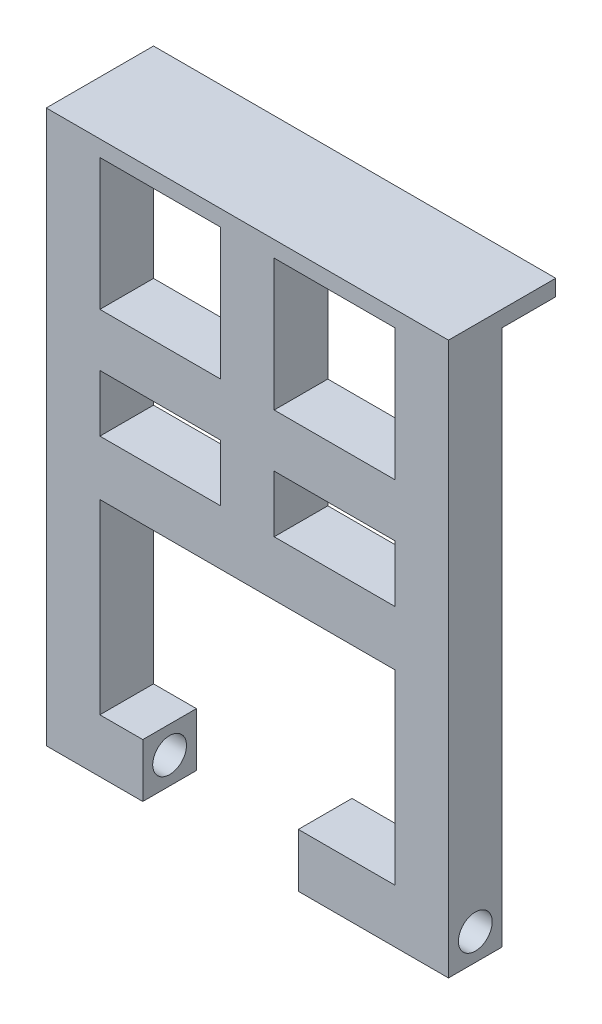
ISO-10303-21;
HEADER;
FILE_DESCRIPTION(('STEP AP214'),'2;1');
FILE_NAME('part.step','',(''),(''),'','','');
FILE_SCHEMA(('AUTOMOTIVE_DESIGN { 1 0 10303 214 1 1 1 1 }'));
ENDSEC;
DATA;
#1=APPLICATION_CONTEXT('core data for automotive mechanical design processes');
#2=APPLICATION_PROTOCOL_DEFINITION('international standard','automotive_design',2000,#1);
#3=PRODUCT_CONTEXT('',#1,'mechanical');
#4=PRODUCT('Part','Part','',(#3));
#5=PRODUCT_RELATED_PRODUCT_CATEGORY('part','',(#4));
#6=PRODUCT_DEFINITION_FORMATION('','',#4);
#7=PRODUCT_DEFINITION_CONTEXT('part definition',#1,'design');
#8=PRODUCT_DEFINITION('design','',#6,#7);
#9=PRODUCT_DEFINITION_SHAPE('','',#8);
#10=(LENGTH_UNIT() NAMED_UNIT(*) SI_UNIT(.MILLI.,.METRE.));
#11=(NAMED_UNIT(*) PLANE_ANGLE_UNIT() SI_UNIT($,.RADIAN.));
#12=(NAMED_UNIT(*) SI_UNIT($,.STERADIAN.) SOLID_ANGLE_UNIT());
#13=UNCERTAINTY_MEASURE_WITH_UNIT(LENGTH_MEASURE(1.E-05),#10,'distance_accuracy_value','');
#14=(GEOMETRIC_REPRESENTATION_CONTEXT(3) GLOBAL_UNCERTAINTY_ASSIGNED_CONTEXT((#13)) GLOBAL_UNIT_ASSIGNED_CONTEXT((#10,
#11,#12)) REPRESENTATION_CONTEXT('',''));
#15=CARTESIAN_POINT('',(0.,0.,0.));
#16=DIRECTION('',(0.,0.,1.));
#17=DIRECTION('',(1.,0.,0.));
#18=AXIS2_PLACEMENT_3D('',#15,#16,#17);
#19=CARTESIAN_POINT('',(10.,0.,-10.));
#20=DIRECTION('',(1.,0.,0.));
#21=DIRECTION('',(0.,1.,0.));
#22=AXIS2_PLACEMENT_3D('',#19,#20,#21);
#23=PLANE('',#22);
#24=DIRECTION('',(0.,0.,1.));
#25=VECTOR('',#24,1.);
#26=CARTESIAN_POINT('',(10.,-55.2330837223078,-10.));
#27=LINE('',#26,#25);
#28=CARTESIAN_POINT('',(10.,-55.2330837223078,-10.));
#29=VERTEX_POINT('',#28);
#30=CARTESIAN_POINT('',(10.,-55.2330837223078,0.));
#31=VERTEX_POINT('',#30);
#32=EDGE_CURVE('E343',#29,#31,#27,.T.);
#33=ORIENTED_EDGE('',*,*,#32,.T.);
#34=DIRECTION('',(0.,1.,0.));
#35=VECTOR('',#34,1.);
#36=CARTESIAN_POINT('',(10.,0.,0.));
#37=LINE('',#36,#35);
#38=CARTESIAN_POINT('',(10.,-90.,0.));
#39=VERTEX_POINT('',#38);
#40=EDGE_CURVE('E430',#39,#31,#37,.T.);
#41=ORIENTED_EDGE('',*,*,#40,.F.);
#42=DIRECTION('',(0.,0.,1.));
#43=VECTOR('',#42,1.);
#44=CARTESIAN_POINT('',(10.,-90.,-10.));
#45=LINE('',#44,#43);
#46=CARTESIAN_POINT('',(10.,-90.,-10.));
#47=VERTEX_POINT('',#46);
#48=EDGE_CURVE('E391',#47,#39,#45,.T.);
#49=ORIENTED_EDGE('',*,*,#48,.F.);
#50=DIRECTION('',(0.,1.,0.));
#51=VECTOR('',#50,1.);
#52=CARTESIAN_POINT('',(10.,0.,-10.));
#53=LINE('',#52,#51);
#54=EDGE_CURVE('E433',#47,#29,#53,.T.);
#55=ORIENTED_EDGE('',*,*,#54,.T.);
#56=EDGE_LOOP('',(#33,#41,#49,#55));
#57=FACE_BOUND('',#56,.T.);
#58=ADVANCED_FACE('F37',(#57),#23,.T.);
#59=DIRECTION('',(0.,0.,1.));
#60=VECTOR('',#59,1.);
#61=CARTESIAN_POINT('',(10.,-24.5309190207446,-10.));
#62=LINE('',#61,#60);
#63=CARTESIAN_POINT('',(10.,-24.5309190207446,-10.));
#64=VERTEX_POINT('',#63);
#65=CARTESIAN_POINT('',(10.,-24.5309190207446,0.));
#66=VERTEX_POINT('',#65);
#67=EDGE_CURVE('E317',#64,#66,#62,.T.);
#68=ORIENTED_EDGE('',*,*,#67,.F.);
#69=CARTESIAN_POINT('',(10.,0.,-10.));
#70=VERTEX_POINT('',#69);
#71=EDGE_CURVE('E432',#64,#70,#53,.T.);
#72=ORIENTED_EDGE('',*,*,#71,.T.);
#73=DIRECTION('',(0.,0.,1.));
#74=VECTOR('',#73,1.);
#75=CARTESIAN_POINT('',(10.,0.,-10.));
#76=LINE('',#75,#74);
#77=CARTESIAN_POINT('',(10.,0.,0.));
#78=VERTEX_POINT('',#77);
#79=EDGE_CURVE('E444',#70,#78,#76,.T.);
#80=ORIENTED_EDGE('',*,*,#79,.T.);
#81=EDGE_CURVE('E61',#66,#78,#37,.T.);
#82=ORIENTED_EDGE('',*,*,#81,.F.);
#83=EDGE_LOOP('',(#68,#72,#80,#82));
#84=FACE_BOUND('',#83,.T.);
#85=ADVANCED_FACE('F547',(#84),#23,.T.);
#86=CARTESIAN_POINT('',(65.,0.,-10.));
#87=DIRECTION('',(-1.,0.,0.));
#88=DIRECTION('',(0.,-1.,0.));
#89=AXIS2_PLACEMENT_3D('',#86,#87,#88);
#90=PLANE('',#89);
#91=DIRECTION('',(0.,0.,1.));
#92=VECTOR('',#91,1.);
#93=CARTESIAN_POINT('',(65.,-24.5309190207446,-10.));
#94=LINE('',#93,#92);
#95=CARTESIAN_POINT('',(65.,-24.5309190207446,-10.));
#96=VERTEX_POINT('',#95);
#97=CARTESIAN_POINT('',(65.,-24.5309190207446,0.));
#98=VERTEX_POINT('',#97);
#99=EDGE_CURVE('E329',#96,#98,#94,.T.);
#100=ORIENTED_EDGE('',*,*,#99,.T.);
#101=DIRECTION('',(0.,-1.,0.));
#102=VECTOR('',#101,1.);
#103=CARTESIAN_POINT('',(65.,0.,0.));
#104=LINE('',#103,#102);
#105=CARTESIAN_POINT('',(65.,0.,0.));
#106=VERTEX_POINT('',#105);
#107=EDGE_CURVE('E414',#106,#98,#104,.T.);
#108=ORIENTED_EDGE('',*,*,#107,.F.);
#109=DIRECTION('',(0.,0.,1.));
#110=VECTOR('',#109,1.);
#111=CARTESIAN_POINT('',(65.,0.,-10.));
#112=LINE('',#111,#110);
#113=CARTESIAN_POINT('',(65.,0.,-10.));
#114=VERTEX_POINT('',#113);
#115=EDGE_CURVE('E413',#114,#106,#112,.T.);
#116=ORIENTED_EDGE('',*,*,#115,.F.);
#117=DIRECTION('',(0.,-1.,0.));
#118=VECTOR('',#117,1.);
#119=CARTESIAN_POINT('',(65.,0.,-10.));
#120=LINE('',#119,#118);
#121=EDGE_CURVE('E407',#114,#96,#120,.T.);
#122=ORIENTED_EDGE('',*,*,#121,.T.);
#123=EDGE_LOOP('',(#100,#108,#116,#122));
#124=FACE_BOUND('',#123,.T.);
#125=ADVANCED_FACE('F566',(#124),#90,.T.);
#126=DIRECTION('',(0.,0.,1.));
#127=VECTOR('',#126,1.);
#128=CARTESIAN_POINT('',(65.,-34.3944395520984,-10.));
#129=LINE('',#128,#127);
#130=CARTESIAN_POINT('',(65.,-34.3944395520984,-10.));
#131=VERTEX_POINT('',#130);
#132=CARTESIAN_POINT('',(65.,-34.3944395520984,0.));
#133=VERTEX_POINT('',#132);
#134=EDGE_CURVE('E331',#131,#133,#129,.T.);
#135=ORIENTED_EDGE('',*,*,#134,.F.);
#136=CARTESIAN_POINT('',(65.,-45.,-10.));
#137=VERTEX_POINT('',#136);
#138=EDGE_CURVE('E410',#131,#137,#120,.T.);
#139=ORIENTED_EDGE('',*,*,#138,.T.);
#140=DIRECTION('',(0.,0.,1.));
#141=VECTOR('',#140,1.);
#142=CARTESIAN_POINT('',(65.,-45.,-10.));
#143=LINE('',#142,#141);
#144=CARTESIAN_POINT('',(65.,-45.,0.));
#145=VERTEX_POINT('',#144);
#146=EDGE_CURVE('E338',#137,#145,#143,.T.);
#147=ORIENTED_EDGE('',*,*,#146,.T.);
#148=EDGE_CURVE('E417',#133,#145,#104,.T.);
#149=ORIENTED_EDGE('',*,*,#148,.F.);
#150=EDGE_LOOP('',(#135,#139,#147,#149));
#151=FACE_BOUND('',#150,.T.);
#152=ADVANCED_FACE('F503',(#151),#90,.T.);
#153=CARTESIAN_POINT('',(0.,3.,0.));
#154=DIRECTION('',(1.,0.,0.));
#155=DIRECTION('',(0.,0.,-1.));
#156=AXIS2_PLACEMENT_3D('',#153,#154,#155);
#157=PLANE('',#156);
#158=CARTESIAN_POINT('',(0.,-95.,-5.));
#159=DIRECTION('',(1.,0.,0.));
#160=DIRECTION('',(0.,0.,-1.));
#161=AXIS2_PLACEMENT_3D('',#158,#159,#160);
#162=CIRCLE('',#161,3.15);
#163=CARTESIAN_POINT('',(0.,-95.,-8.15));
#164=VERTEX_POINT('',#163);
#165=EDGE_CURVE('E352',#164,#164,#162,.T.);
#166=ORIENTED_EDGE('',*,*,#165,.T.);
#167=EDGE_LOOP('',(#166));
#168=FACE_BOUND('',#167,.T.);
#169=DIRECTION('',(0.,0.,1.));
#170=VECTOR('',#169,1.);
#171=CARTESIAN_POINT('',(0.,0.,0.));
#172=LINE('',#171,#170);
#173=CARTESIAN_POINT('',(0.,0.,-20.));
#174=VERTEX_POINT('',#173);
#175=CARTESIAN_POINT('',(0.,0.,-10.));
#176=VERTEX_POINT('',#175);
#177=EDGE_CURVE('E446',#174,#176,#172,.T.);
#178=ORIENTED_EDGE('',*,*,#177,.T.);
#179=DIRECTION('',(0.,-1.,0.));
#180=VECTOR('',#179,1.);
#181=CARTESIAN_POINT('',(0.,0.,-10.));
#182=LINE('',#181,#180);
#183=CARTESIAN_POINT('',(0.,-100.,-10.));
#184=VERTEX_POINT('',#183);
#185=EDGE_CURVE('E426',#176,#184,#182,.T.);
#186=ORIENTED_EDGE('',*,*,#185,.T.);
#187=DIRECTION('',(0.,0.,1.));
#188=VECTOR('',#187,1.);
#189=CARTESIAN_POINT('',(0.,-100.,-10.));
#190=LINE('',#189,#188);
#191=CARTESIAN_POINT('',(0.,-100.,0.));
#192=VERTEX_POINT('',#191);
#193=EDGE_CURVE('E439',#184,#192,#190,.T.);
#194=ORIENTED_EDGE('',*,*,#193,.T.);
#195=DIRECTION('',(0.,-1.,0.));
#196=VECTOR('',#195,1.);
#197=CARTESIAN_POINT('',(0.,3.,0.));
#198=LINE('',#197,#196);
#199=CARTESIAN_POINT('',(0.,3.,0.));
#200=VERTEX_POINT('',#199);
#201=EDGE_CURVE('E11',#200,#192,#198,.T.);
#202=ORIENTED_EDGE('',*,*,#201,.F.);
#203=DIRECTION('',(0.,0.,1.));
#204=VECTOR('',#203,1.);
#205=CARTESIAN_POINT('',(0.,3.,0.));
#206=LINE('',#205,#204);
#207=CARTESIAN_POINT('',(0.,3.,-20.));
#208=VERTEX_POINT('',#207);
#209=EDGE_CURVE('E449',#208,#200,#206,.T.);
#210=ORIENTED_EDGE('',*,*,#209,.F.);
#211=DIRECTION('',(0.,-1.,0.));
#212=VECTOR('',#211,1.);
#213=CARTESIAN_POINT('',(0.,3.,-20.));
#214=LINE('',#213,#212);
#215=EDGE_CURVE('E459',#208,#174,#214,.T.);
#216=ORIENTED_EDGE('',*,*,#215,.T.);
#217=EDGE_LOOP('',(#178,#186,#194,#202,#210,#216));
#218=FACE_BOUND('',#217,.T.);
#219=ADVANCED_FACE('F39',(#168,#218),#157,.F.);
#220=CARTESIAN_POINT('',(0.,3.,0.));
#221=DIRECTION('',(0.,0.,-1.));
#222=DIRECTION('',(-1.,0.,0.));
#223=AXIS2_PLACEMENT_3D('',#220,#221,#222);
#224=PLANE('',#223);
#225=DIRECTION('',(1.,0.,0.));
#226=VECTOR('',#225,1.);
#227=CARTESIAN_POINT('',(0.,0.,0.));
#228=LINE('',#227,#226);
#229=CARTESIAN_POINT('',(32.5,0.,0.));
#230=VERTEX_POINT('',#229);
#231=EDGE_CURVE('E463',#78,#230,#228,.T.);
#232=ORIENTED_EDGE('',*,*,#231,.T.);
#233=DIRECTION('',(0.,-1.,0.));
#234=VECTOR('',#233,1.);
#235=CARTESIAN_POINT('',(32.5,0.,0.));
#236=LINE('',#235,#234);
#237=CARTESIAN_POINT('',(32.5,-24.5309190207446,0.));
#238=VERTEX_POINT('',#237);
#239=EDGE_CURVE('E263',#230,#238,#236,.T.);
#240=ORIENTED_EDGE('',*,*,#239,.T.);
#241=DIRECTION('',(-1.,0.,0.));
#242=VECTOR('',#241,1.);
#243=CARTESIAN_POINT('',(10.,-24.5309190207446,0.));
#244=LINE('',#243,#242);
#245=EDGE_CURVE('E260',#238,#66,#244,.T.);
#246=ORIENTED_EDGE('',*,*,#245,.T.);
#247=ORIENTED_EDGE('',*,*,#81,.T.);
#248=EDGE_LOOP('',(#232,#240,#246,#247));
#249=FACE_BOUND('',#248,.T.);
#250=CARTESIAN_POINT('',(10.,-45.,0.));
#251=VERTEX_POINT('',#250);
#252=CARTESIAN_POINT('',(10.,-34.3944395520984,0.));
#253=VERTEX_POINT('',#252);
#254=EDGE_CURVE('E443',#251,#253,#37,.T.);
#255=ORIENTED_EDGE('',*,*,#254,.T.);
#256=DIRECTION('',(1.,0.,0.));
#257=VECTOR('',#256,1.);
#258=CARTESIAN_POINT('',(10.,-34.3944395520984,0.));
#259=LINE('',#258,#257);
#260=CARTESIAN_POINT('',(32.5,-34.3944395520984,0.));
#261=VERTEX_POINT('',#260);
#262=EDGE_CURVE('E294',#253,#261,#259,.T.);
#263=ORIENTED_EDGE('',*,*,#262,.T.);
#264=DIRECTION('',(0.,-1.,0.));
#265=VECTOR('',#264,1.);
#266=CARTESIAN_POINT('',(32.5,-34.3944395520984,0.));
#267=LINE('',#266,#265);
#268=CARTESIAN_POINT('',(32.5,-45.,0.));
#269=VERTEX_POINT('',#268);
#270=EDGE_CURVE('E241',#261,#269,#267,.T.);
#271=ORIENTED_EDGE('',*,*,#270,.T.);
#272=DIRECTION('',(-1.,0.,0.));
#273=VECTOR('',#272,1.);
#274=CARTESIAN_POINT('',(10.,-45.,0.));
#275=LINE('',#274,#273);
#276=EDGE_CURVE('E297',#269,#251,#275,.T.);
#277=ORIENTED_EDGE('',*,*,#276,.T.);
#278=EDGE_LOOP('',(#255,#263,#271,#277));
#279=FACE_BOUND('',#278,.T.);
#280=ORIENTED_EDGE('',*,*,#40,.T.);
#281=DIRECTION('',(1.,0.,0.));
#282=VECTOR('',#281,1.);
#283=CARTESIAN_POINT('',(42.5,-55.2330837223077,0.));
#284=LINE('',#283,#282);
#285=CARTESIAN_POINT('',(65.,-55.2330837223078,0.));
#286=VERTEX_POINT('',#285);
#287=EDGE_CURVE('E300',#31,#286,#284,.T.);
#288=ORIENTED_EDGE('',*,*,#287,.T.);
#289=CARTESIAN_POINT('',(65.,-90.,0.));
#290=VERTEX_POINT('',#289);
#291=EDGE_CURVE('E394',#286,#290,#104,.T.);
#292=ORIENTED_EDGE('',*,*,#291,.T.);
#293=DIRECTION('',(-1.,0.,0.));
#294=VECTOR('',#293,1.);
#295=CARTESIAN_POINT('',(65.,-90.,0.));
#296=LINE('',#295,#294);
#297=CARTESIAN_POINT('',(47.,-90.,0.));
#298=VERTEX_POINT('',#297);
#299=EDGE_CURVE('E358',#290,#298,#296,.T.);
#300=ORIENTED_EDGE('',*,*,#299,.T.);
#301=DIRECTION('',(0.,-1.,0.));
#302=VECTOR('',#301,1.);
#303=CARTESIAN_POINT('',(47.,-100.,0.));
#304=LINE('',#303,#302);
#305=CARTESIAN_POINT('',(47.,-100.,0.));
#306=VERTEX_POINT('',#305);
#307=EDGE_CURVE('E363',#298,#306,#304,.T.);
#308=ORIENTED_EDGE('',*,*,#307,.T.);
#309=DIRECTION('',(1.,0.,0.));
#310=VECTOR('',#309,1.);
#311=CARTESIAN_POINT('',(75.,-100.,0.));
#312=LINE('',#311,#310);
#313=CARTESIAN_POINT('',(75.,-100.,0.));
#314=VERTEX_POINT('',#313);
#315=EDGE_CURVE('E403',#306,#314,#312,.T.);
#316=ORIENTED_EDGE('',*,*,#315,.T.);
#317=DIRECTION('',(0.,-1.,0.));
#318=VECTOR('',#317,1.);
#319=CARTESIAN_POINT('',(75.,3.,0.));
#320=LINE('',#319,#318);
#321=CARTESIAN_POINT('',(75.,3.,0.));
#322=VERTEX_POINT('',#321);
#323=EDGE_CURVE('E46',#322,#314,#320,.T.);
#324=ORIENTED_EDGE('',*,*,#323,.F.);
#325=DIRECTION('',(1.,0.,0.));
#326=VECTOR('',#325,1.);
#327=CARTESIAN_POINT('',(0.,3.,0.));
#328=LINE('',#327,#326);
#329=EDGE_CURVE('E452',#200,#322,#328,.T.);
#330=ORIENTED_EDGE('',*,*,#329,.F.);
#331=ORIENTED_EDGE('',*,*,#201,.T.);
#332=DIRECTION('',(1.,0.,0.));
#333=VECTOR('',#332,1.);
#334=CARTESIAN_POINT('',(0.,-100.,0.));
#335=LINE('',#334,#333);
#336=CARTESIAN_POINT('',(18.,-100.,0.));
#337=VERTEX_POINT('',#336);
#338=EDGE_CURVE('E423',#192,#337,#335,.T.);
#339=ORIENTED_EDGE('',*,*,#338,.T.);
#340=DIRECTION('',(0.,1.,0.));
#341=VECTOR('',#340,1.);
#342=CARTESIAN_POINT('',(18.,-100.,0.));
#343=LINE('',#342,#341);
#344=CARTESIAN_POINT('',(18.,-90.,0.));
#345=VERTEX_POINT('',#344);
#346=EDGE_CURVE('E374',#337,#345,#343,.T.);
#347=ORIENTED_EDGE('',*,*,#346,.T.);
#348=DIRECTION('',(-1.,0.,0.));
#349=VECTOR('',#348,1.);
#350=CARTESIAN_POINT('',(10.,-90.,0.));
#351=LINE('',#350,#349);
#352=EDGE_CURVE('E383',#345,#39,#351,.T.);
#353=ORIENTED_EDGE('',*,*,#352,.T.);
#354=EDGE_LOOP('',(#280,#288,#292,#300,#308,#316,#324,#330,#331,#339,#347,#353));
#355=FACE_BOUND('',#354,.T.);
#356=ORIENTED_EDGE('',*,*,#148,.T.);
#357=DIRECTION('',(-1.,0.,0.));
#358=VECTOR('',#357,1.);
#359=CARTESIAN_POINT('',(42.5,-45.,0.));
#360=LINE('',#359,#358);
#361=CARTESIAN_POINT('',(42.5,-45.,0.));
#362=VERTEX_POINT('',#361);
#363=EDGE_CURVE('E303',#145,#362,#360,.T.);
#364=ORIENTED_EDGE('',*,*,#363,.T.);
#365=DIRECTION('',(0.,1.,0.));
#366=VECTOR('',#365,1.);
#367=CARTESIAN_POINT('',(42.5,-34.3944395520984,0.));
#368=LINE('',#367,#366);
#369=CARTESIAN_POINT('',(42.5,-34.3944395520984,0.));
#370=VERTEX_POINT('',#369);
#371=EDGE_CURVE('E306',#362,#370,#368,.T.);
#372=ORIENTED_EDGE('',*,*,#371,.T.);
#373=DIRECTION('',(1.,0.,0.));
#374=VECTOR('',#373,1.);
#375=CARTESIAN_POINT('',(42.5,-34.3944395520984,0.));
#376=LINE('',#375,#374);
#377=EDGE_CURVE('E309',#370,#133,#376,.T.);
#378=ORIENTED_EDGE('',*,*,#377,.T.);
#379=EDGE_LOOP('',(#356,#364,#372,#378));
#380=FACE_BOUND('',#379,.T.);
#381=DIRECTION('',(0.,1.,0.));
#382=VECTOR('',#381,1.);
#383=CARTESIAN_POINT('',(42.5,0.,0.));
#384=LINE('',#383,#382);
#385=CARTESIAN_POINT('',(42.5,-24.5309190207446,0.));
#386=VERTEX_POINT('',#385);
#387=CARTESIAN_POINT('',(42.5,0.,0.));
#388=VERTEX_POINT('',#387);
#389=EDGE_CURVE('E53',#386,#388,#384,.T.);
#390=ORIENTED_EDGE('',*,*,#389,.T.);
#391=EDGE_CURVE('E462',#388,#106,#228,.T.);
#392=ORIENTED_EDGE('',*,*,#391,.T.);
#393=ORIENTED_EDGE('',*,*,#107,.T.);
#394=DIRECTION('',(-1.,0.,0.));
#395=VECTOR('',#394,1.);
#396=CARTESIAN_POINT('',(42.5,-24.5309190207446,0.));
#397=LINE('',#396,#395);
#398=EDGE_CURVE('E312',#98,#386,#397,.T.);
#399=ORIENTED_EDGE('',*,*,#398,.T.);
#400=EDGE_LOOP('',(#390,#392,#393,#399));
#401=FACE_BOUND('',#400,.T.);
#402=ADVANCED_FACE('F484',(#249,#279,#355,#380,#401),#224,.F.);
#403=CARTESIAN_POINT('',(75.,3.,0.));
#404=DIRECTION('',(-1.,0.,0.));
#405=DIRECTION('',(0.,0.,1.));
#406=AXIS2_PLACEMENT_3D('',#403,#404,#405);
#407=PLANE('',#406);
#408=CARTESIAN_POINT('',(75.,-95.,-5.));
#409=DIRECTION('',(1.,0.,0.));
#410=DIRECTION('',(0.,0.,-1.));
#411=AXIS2_PLACEMENT_3D('',#408,#409,#410);
#412=CIRCLE('',#411,3.15);
#413=CARTESIAN_POINT('',(75.,-95.,-8.15));
#414=VERTEX_POINT('',#413);
#415=EDGE_CURVE('E319',#414,#414,#412,.T.);
#416=ORIENTED_EDGE('',*,*,#415,.F.);
#417=EDGE_LOOP('',(#416));
#418=FACE_BOUND('',#417,.T.);
#419=ORIENTED_EDGE('',*,*,#323,.T.);
#420=DIRECTION('',(0.,0.,1.));
#421=VECTOR('',#420,1.);
#422=CARTESIAN_POINT('',(75.,-100.,-10.));
#423=LINE('',#422,#421);
#424=CARTESIAN_POINT('',(75.,-100.,-10.));
#425=VERTEX_POINT('',#424);
#426=EDGE_CURVE('E420',#425,#314,#423,.T.);
#427=ORIENTED_EDGE('',*,*,#426,.F.);
#428=DIRECTION('',(0.,1.,0.));
#429=VECTOR('',#428,1.);
#430=CARTESIAN_POINT('',(75.,0.,-10.));
#431=LINE('',#430,#429);
#432=CARTESIAN_POINT('',(75.,0.,-10.));
#433=VERTEX_POINT('',#432);
#434=EDGE_CURVE('E399',#425,#433,#431,.T.);
#435=ORIENTED_EDGE('',*,*,#434,.T.);
#436=DIRECTION('',(0.,0.,-1.));
#437=VECTOR('',#436,1.);
#438=CARTESIAN_POINT('',(75.,0.,0.));
#439=LINE('',#438,#437);
#440=CARTESIAN_POINT('',(75.,0.,-20.));
#441=VERTEX_POINT('',#440);
#442=EDGE_CURVE('E466',#433,#441,#439,.T.);
#443=ORIENTED_EDGE('',*,*,#442,.T.);
#444=DIRECTION('',(0.,-1.,0.));
#445=VECTOR('',#444,1.);
#446=CARTESIAN_POINT('',(75.,3.,-20.));
#447=LINE('',#446,#445);
#448=CARTESIAN_POINT('',(75.,3.,-20.));
#449=VERTEX_POINT('',#448);
#450=EDGE_CURVE('E471',#449,#441,#447,.T.);
#451=ORIENTED_EDGE('',*,*,#450,.F.);
#452=DIRECTION('',(0.,0.,-1.));
#453=VECTOR('',#452,1.);
#454=CARTESIAN_POINT('',(75.,3.,0.));
#455=LINE('',#454,#453);
#456=EDGE_CURVE('E455',#322,#449,#455,.T.);
#457=ORIENTED_EDGE('',*,*,#456,.F.);
#458=EDGE_LOOP('',(#419,#427,#435,#443,#451,#457));
#459=FACE_BOUND('',#458,.T.);
#460=ADVANCED_FACE('F477',(#418,#459),#407,.F.);
#461=CARTESIAN_POINT('',(0.,3.,-20.));
#462=DIRECTION('',(0.,0.,1.));
#463=DIRECTION('',(1.,0.,0.));
#464=AXIS2_PLACEMENT_3D('',#461,#462,#463);
#465=PLANE('',#464);
#466=DIRECTION('',(-1.,0.,0.));
#467=VECTOR('',#466,1.);
#468=CARTESIAN_POINT('',(0.,0.,-20.));
#469=LINE('',#468,#467);
#470=EDGE_CURVE('E453',#441,#174,#469,.T.);
#471=ORIENTED_EDGE('',*,*,#470,.T.);
#472=ORIENTED_EDGE('',*,*,#215,.F.);
#473=DIRECTION('',(-1.,0.,0.));
#474=VECTOR('',#473,1.);
#475=CARTESIAN_POINT('',(0.,3.,-20.));
#476=LINE('',#475,#474);
#477=EDGE_CURVE('E457',#449,#208,#476,.T.);
#478=ORIENTED_EDGE('',*,*,#477,.F.);
#479=ORIENTED_EDGE('',*,*,#450,.T.);
#480=EDGE_LOOP('',(#471,#472,#478,#479));
#481=FACE_BOUND('',#480,.T.);
#482=ADVANCED_FACE('F573',(#481),#465,.F.);
#483=CARTESIAN_POINT('',(0.,3.,0.));
#484=DIRECTION('',(0.,-1.,0.));
#485=DIRECTION('',(0.,0.,-1.));
#486=AXIS2_PLACEMENT_3D('',#483,#484,#485);
#487=PLANE('',#486);
#488=ORIENTED_EDGE('',*,*,#209,.T.);
#489=ORIENTED_EDGE('',*,*,#329,.T.);
#490=ORIENTED_EDGE('',*,*,#456,.T.);
#491=ORIENTED_EDGE('',*,*,#477,.T.);
#492=EDGE_LOOP('',(#488,#489,#490,#491));
#493=FACE_BOUND('',#492,.T.);
#494=ADVANCED_FACE('F593',(#493),#487,.F.);
#495=CARTESIAN_POINT('',(0.,0.,0.));
#496=DIRECTION('',(0.,-1.,0.));
#497=DIRECTION('',(0.,0.,-1.));
#498=AXIS2_PLACEMENT_3D('',#495,#496,#497);
#499=PLANE('',#498);
#500=DIRECTION('',(0.,0.,1.));
#501=VECTOR('',#500,1.);
#502=CARTESIAN_POINT('',(32.5,0.,-10.));
#503=LINE('',#502,#501);
#504=CARTESIAN_POINT('',(32.5,0.,-10.));
#505=VERTEX_POINT('',#504);
#506=EDGE_CURVE('E322',#505,#230,#503,.T.);
#507=ORIENTED_EDGE('',*,*,#506,.T.);
#508=ORIENTED_EDGE('',*,*,#231,.F.);
#509=ORIENTED_EDGE('',*,*,#79,.F.);
#510=DIRECTION('',(-1.,0.,0.));
#511=VECTOR('',#510,1.);
#512=CARTESIAN_POINT('',(0.,0.,-10.));
#513=LINE('',#512,#511);
#514=EDGE_CURVE('E435',#70,#176,#513,.T.);
#515=ORIENTED_EDGE('',*,*,#514,.T.);
#516=ORIENTED_EDGE('',*,*,#177,.F.);
#517=ORIENTED_EDGE('',*,*,#470,.F.);
#518=ORIENTED_EDGE('',*,*,#442,.F.);
#519=DIRECTION('',(-1.,0.,0.));
#520=VECTOR('',#519,1.);
#521=CARTESIAN_POINT('',(75.,0.,-10.));
#522=LINE('',#521,#520);
#523=EDGE_CURVE('E402',#433,#114,#522,.T.);
#524=ORIENTED_EDGE('',*,*,#523,.T.);
#525=ORIENTED_EDGE('',*,*,#115,.T.);
#526=ORIENTED_EDGE('',*,*,#391,.F.);
#527=DIRECTION('',(0.,0.,1.));
#528=VECTOR('',#527,1.);
#529=CARTESIAN_POINT('',(42.5,0.,-10.));
#530=LINE('',#529,#528);
#531=CARTESIAN_POINT('',(42.5,0.,-10.));
#532=VERTEX_POINT('',#531);
#533=EDGE_CURVE('E325',#532,#388,#530,.T.);
#534=ORIENTED_EDGE('',*,*,#533,.F.);
#535=DIRECTION('',(-1.,0.,0.));
#536=VECTOR('',#535,1.);
#537=CARTESIAN_POINT('',(32.5,0.,-10.));
#538=LINE('',#537,#536);
#539=EDGE_CURVE('E285',#532,#505,#538,.T.);
#540=ORIENTED_EDGE('',*,*,#539,.T.);
#541=EDGE_LOOP('',(#507,#508,#509,#515,#516,#517,#518,#524,#525,#526,#534,#540));
#542=FACE_BOUND('',#541,.T.);
#543=ADVANCED_FACE('F541',(#542),#499,.T.);
#544=DIRECTION('',(0.,0.,1.));
#545=VECTOR('',#544,1.);
#546=CARTESIAN_POINT('',(10.,-45.,-10.));
#547=LINE('',#546,#545);
#548=CARTESIAN_POINT('',(10.,-45.,-10.));
#549=VERTEX_POINT('',#548);
#550=EDGE_CURVE('E345',#549,#251,#547,.T.);
#551=ORIENTED_EDGE('',*,*,#550,.F.);
#552=CARTESIAN_POINT('',(10.,-34.3944395520984,-10.));
#553=VERTEX_POINT('',#552);
#554=EDGE_CURVE('E436',#549,#553,#53,.T.);
#555=ORIENTED_EDGE('',*,*,#554,.T.);
#556=DIRECTION('',(0.,0.,1.));
#557=VECTOR('',#556,1.);
#558=CARTESIAN_POINT('',(10.,-34.3944395520984,-10.));
#559=LINE('',#558,#557);
#560=EDGE_CURVE('E247',#553,#253,#559,.T.);
#561=ORIENTED_EDGE('',*,*,#560,.T.);
#562=ORIENTED_EDGE('',*,*,#254,.F.);
#563=EDGE_LOOP('',(#551,#555,#561,#562));
#564=FACE_BOUND('',#563,.T.);
#565=ADVANCED_FACE('F580',(#564),#23,.T.);
#566=CARTESIAN_POINT('',(0.,-100.,-10.));
#567=DIRECTION('',(0.,-1.,0.));
#568=DIRECTION('',(0.,0.,-1.));
#569=AXIS2_PLACEMENT_3D('',#566,#567,#568);
#570=PLANE('',#569);
#571=ORIENTED_EDGE('',*,*,#338,.F.);
#572=ORIENTED_EDGE('',*,*,#193,.F.);
#573=DIRECTION('',(1.,0.,0.));
#574=VECTOR('',#573,1.);
#575=CARTESIAN_POINT('',(0.,-100.,-10.));
#576=LINE('',#575,#574);
#577=CARTESIAN_POINT('',(18.,-100.,-10.));
#578=VERTEX_POINT('',#577);
#579=EDGE_CURVE('E429',#184,#578,#576,.T.);
#580=ORIENTED_EDGE('',*,*,#579,.T.);
#581=DIRECTION('',(0.,0.,1.));
#582=VECTOR('',#581,1.);
#583=CARTESIAN_POINT('',(18.,-100.,-10.));
#584=LINE('',#583,#582);
#585=EDGE_CURVE('E386',#578,#337,#584,.T.);
#586=ORIENTED_EDGE('',*,*,#585,.T.);
#587=EDGE_LOOP('',(#571,#572,#580,#586));
#588=FACE_BOUND('',#587,.T.);
#589=ADVANCED_FACE('F587',(#588),#570,.T.);
#590=CARTESIAN_POINT('',(0.,0.,-10.));
#591=DIRECTION('',(0.,0.,1.));
#592=DIRECTION('',(1.,0.,0.));
#593=AXIS2_PLACEMENT_3D('',#590,#591,#592);
#594=PLANE('',#593);
#595=DIRECTION('',(1.,0.,0.));
#596=VECTOR('',#595,1.);
#597=CARTESIAN_POINT('',(10.,-34.3944395520984,-10.));
#598=LINE('',#597,#596);
#599=CARTESIAN_POINT('',(32.5,-34.3944395520984,-10.));
#600=VERTEX_POINT('',#599);
#601=EDGE_CURVE('E254',#553,#600,#598,.T.);
#602=ORIENTED_EDGE('',*,*,#601,.F.);
#603=ORIENTED_EDGE('',*,*,#554,.F.);
#604=DIRECTION('',(-1.,0.,0.));
#605=VECTOR('',#604,1.);
#606=CARTESIAN_POINT('',(10.,-45.,-10.));
#607=LINE('',#606,#605);
#608=CARTESIAN_POINT('',(32.5,-45.,-10.));
#609=VERTEX_POINT('',#608);
#610=EDGE_CURVE('E256',#609,#549,#607,.T.);
#611=ORIENTED_EDGE('',*,*,#610,.F.);
#612=DIRECTION('',(0.,-1.,0.));
#613=VECTOR('',#612,1.);
#614=CARTESIAN_POINT('',(32.5,-34.3944395520984,-10.));
#615=LINE('',#614,#613);
#616=EDGE_CURVE('E239',#600,#609,#615,.T.);
#617=ORIENTED_EDGE('',*,*,#616,.F.);
#618=EDGE_LOOP('',(#602,#603,#611,#617));
#619=FACE_BOUND('',#618,.T.);
#620=ORIENTED_EDGE('',*,*,#185,.F.);
#621=ORIENTED_EDGE('',*,*,#514,.F.);
#622=ORIENTED_EDGE('',*,*,#71,.F.);
#623=DIRECTION('',(-1.,0.,0.));
#624=VECTOR('',#623,1.);
#625=CARTESIAN_POINT('',(10.,-24.5309190207446,-10.));
#626=LINE('',#625,#624);
#627=CARTESIAN_POINT('',(32.5,-24.5309190207446,-10.));
#628=VERTEX_POINT('',#627);
#629=EDGE_CURVE('E291',#628,#64,#626,.T.);
#630=ORIENTED_EDGE('',*,*,#629,.F.);
#631=DIRECTION('',(0.,-1.,0.));
#632=VECTOR('',#631,1.);
#633=CARTESIAN_POINT('',(32.5,0.,-10.));
#634=LINE('',#633,#632);
#635=EDGE_CURVE('E288',#505,#628,#634,.T.);
#636=ORIENTED_EDGE('',*,*,#635,.F.);
#637=ORIENTED_EDGE('',*,*,#539,.F.);
#638=DIRECTION('',(0.,1.,0.));
#639=VECTOR('',#638,1.);
#640=CARTESIAN_POINT('',(42.5,0.,-10.));
#641=LINE('',#640,#639);
#642=CARTESIAN_POINT('',(42.5,-24.5309190207446,-10.));
#643=VERTEX_POINT('',#642);
#644=EDGE_CURVE('E282',#643,#532,#641,.T.);
#645=ORIENTED_EDGE('',*,*,#644,.F.);
#646=DIRECTION('',(-1.,0.,0.));
#647=VECTOR('',#646,1.);
#648=CARTESIAN_POINT('',(42.5,-24.5309190207446,-10.));
#649=LINE('',#648,#647);
#650=EDGE_CURVE('E279',#96,#643,#649,.T.);
#651=ORIENTED_EDGE('',*,*,#650,.F.);
#652=ORIENTED_EDGE('',*,*,#121,.F.);
#653=ORIENTED_EDGE('',*,*,#523,.F.);
#654=ORIENTED_EDGE('',*,*,#434,.F.);
#655=DIRECTION('',(1.,0.,0.));
#656=VECTOR('',#655,1.);
#657=CARTESIAN_POINT('',(75.,-100.,-10.));
#658=LINE('',#657,#656);
#659=CARTESIAN_POINT('',(47.,-100.,-10.));
#660=VERTEX_POINT('',#659);
#661=EDGE_CURVE('E409',#660,#425,#658,.T.);
#662=ORIENTED_EDGE('',*,*,#661,.F.);
#663=DIRECTION('',(0.,-1.,0.));
#664=VECTOR('',#663,1.);
#665=CARTESIAN_POINT('',(47.,-100.,-10.));
#666=LINE('',#665,#664);
#667=CARTESIAN_POINT('',(47.,-90.,-10.));
#668=VERTEX_POINT('',#667);
#669=EDGE_CURVE('E362',#668,#660,#666,.T.);
#670=ORIENTED_EDGE('',*,*,#669,.F.);
#671=DIRECTION('',(-1.,0.,0.));
#672=VECTOR('',#671,1.);
#673=CARTESIAN_POINT('',(65.,-90.,-10.));
#674=LINE('',#673,#672);
#675=CARTESIAN_POINT('',(65.,-90.,-10.));
#676=VERTEX_POINT('',#675);
#677=EDGE_CURVE('E359',#676,#668,#674,.T.);
#678=ORIENTED_EDGE('',*,*,#677,.F.);
#679=CARTESIAN_POINT('',(65.,-55.2330837223077,-10.));
#680=VERTEX_POINT('',#679);
#681=EDGE_CURVE('E406',#680,#676,#120,.T.);
#682=ORIENTED_EDGE('',*,*,#681,.F.);
#683=DIRECTION('',(1.,0.,0.));
#684=VECTOR('',#683,1.);
#685=CARTESIAN_POINT('',(10.,-55.2330837223078,-10.));
#686=LINE('',#685,#684);
#687=EDGE_CURVE('E267',#29,#680,#686,.T.);
#688=ORIENTED_EDGE('',*,*,#687,.F.);
#689=ORIENTED_EDGE('',*,*,#54,.F.);
#690=DIRECTION('',(-1.,0.,0.));
#691=VECTOR('',#690,1.);
#692=CARTESIAN_POINT('',(10.,-90.,-10.));
#693=LINE('',#692,#691);
#694=CARTESIAN_POINT('',(18.,-90.,-10.));
#695=VERTEX_POINT('',#694);
#696=EDGE_CURVE('E382',#695,#47,#693,.T.);
#697=ORIENTED_EDGE('',*,*,#696,.F.);
#698=DIRECTION('',(0.,1.,0.));
#699=VECTOR('',#698,1.);
#700=CARTESIAN_POINT('',(18.,-100.,-10.));
#701=LINE('',#700,#699);
#702=EDGE_CURVE('E379',#578,#695,#701,.T.);
#703=ORIENTED_EDGE('',*,*,#702,.F.);
#704=ORIENTED_EDGE('',*,*,#579,.F.);
#705=EDGE_LOOP('',(#620,#621,#622,#630,#636,#637,#645,#651,#652,#653,#654,#662,#670,#678,#682,
#688,#689,#697,#703,#704));
#706=FACE_BOUND('',#705,.T.);
#707=ORIENTED_EDGE('',*,*,#138,.F.);
#708=DIRECTION('',(1.,0.,0.));
#709=VECTOR('',#708,1.);
#710=CARTESIAN_POINT('',(42.5,-34.3944395520984,-10.));
#711=LINE('',#710,#709);
#712=CARTESIAN_POINT('',(42.5,-34.3944395520984,-10.));
#713=VERTEX_POINT('',#712);
#714=EDGE_CURVE('E276',#713,#131,#711,.T.);
#715=ORIENTED_EDGE('',*,*,#714,.F.);
#716=DIRECTION('',(0.,1.,0.));
#717=VECTOR('',#716,1.);
#718=CARTESIAN_POINT('',(42.5,-34.3944395520984,-10.));
#719=LINE('',#718,#717);
#720=CARTESIAN_POINT('',(42.5,-45.,-10.));
#721=VERTEX_POINT('',#720);
#722=EDGE_CURVE('E273',#721,#713,#719,.T.);
#723=ORIENTED_EDGE('',*,*,#722,.F.);
#724=DIRECTION('',(-1.,0.,0.));
#725=VECTOR('',#724,1.);
#726=CARTESIAN_POINT('',(42.5,-45.,-10.));
#727=LINE('',#726,#725);
#728=EDGE_CURVE('E270',#137,#721,#727,.T.);
#729=ORIENTED_EDGE('',*,*,#728,.F.);
#730=EDGE_LOOP('',(#707,#715,#723,#729));
#731=FACE_BOUND('',#730,.T.);
#732=ADVANCED_FACE('F252',(#619,#706,#731),#594,.F.);
#733=CARTESIAN_POINT('',(75.,-100.,-10.));
#734=DIRECTION('',(0.,-1.,0.));
#735=DIRECTION('',(0.,0.,-1.));
#736=AXIS2_PLACEMENT_3D('',#733,#734,#735);
#737=PLANE('',#736);
#738=ORIENTED_EDGE('',*,*,#315,.F.);
#739=DIRECTION('',(0.,0.,1.));
#740=VECTOR('',#739,1.);
#741=CARTESIAN_POINT('',(47.,-100.,-10.));
#742=LINE('',#741,#740);
#743=EDGE_CURVE('E371',#660,#306,#742,.T.);
#744=ORIENTED_EDGE('',*,*,#743,.F.);
#745=ORIENTED_EDGE('',*,*,#661,.T.);
#746=ORIENTED_EDGE('',*,*,#426,.T.);
#747=EDGE_LOOP('',(#738,#744,#745,#746));
#748=FACE_BOUND('',#747,.T.);
#749=ADVANCED_FACE('F482',(#748),#737,.T.);
#750=DIRECTION('',(0.,0.,1.));
#751=VECTOR('',#750,1.);
#752=CARTESIAN_POINT('',(65.,-55.2330837223077,-10.));
#753=LINE('',#752,#751);
#754=EDGE_CURVE('E340',#680,#286,#753,.T.);
#755=ORIENTED_EDGE('',*,*,#754,.F.);
#756=ORIENTED_EDGE('',*,*,#681,.T.);
#757=DIRECTION('',(0.,0.,1.));
#758=VECTOR('',#757,1.);
#759=CARTESIAN_POINT('',(65.,-90.,-10.));
#760=LINE('',#759,#758);
#761=EDGE_CURVE('E366',#676,#290,#760,.T.);
#762=ORIENTED_EDGE('',*,*,#761,.T.);
#763=ORIENTED_EDGE('',*,*,#291,.F.);
#764=EDGE_LOOP('',(#755,#756,#762,#763));
#765=FACE_BOUND('',#764,.T.);
#766=ADVANCED_FACE('F498',(#765),#90,.T.);
#767=CARTESIAN_POINT('',(10.,-90.,-10.));
#768=DIRECTION('',(0.,1.,0.));
#769=DIRECTION('',(0.,0.,1.));
#770=AXIS2_PLACEMENT_3D('',#767,#768,#769);
#771=PLANE('',#770);
#772=ORIENTED_EDGE('',*,*,#352,.F.);
#773=DIRECTION('',(0.,0.,1.));
#774=VECTOR('',#773,1.);
#775=CARTESIAN_POINT('',(18.,-90.,-10.));
#776=LINE('',#775,#774);
#777=EDGE_CURVE('E395',#695,#345,#776,.T.);
#778=ORIENTED_EDGE('',*,*,#777,.F.);
#779=ORIENTED_EDGE('',*,*,#696,.T.);
#780=ORIENTED_EDGE('',*,*,#48,.T.);
#781=EDGE_LOOP('',(#772,#778,#779,#780));
#782=FACE_BOUND('',#781,.T.);
#783=ADVANCED_FACE('F525',(#782),#771,.T.);
#784=CARTESIAN_POINT('',(18.,-100.,-10.));
#785=DIRECTION('',(1.,0.,0.));
#786=DIRECTION('',(0.,0.,-1.));
#787=AXIS2_PLACEMENT_3D('',#784,#785,#786);
#788=PLANE('',#787);
#789=CARTESIAN_POINT('',(18.,-95.,-5.));
#790=DIRECTION('',(1.,0.,0.));
#791=DIRECTION('',(0.,0.,-1.));
#792=AXIS2_PLACEMENT_3D('',#789,#790,#791);
#793=CIRCLE('',#792,3.15);
#794=CARTESIAN_POINT('',(18.,-95.,-8.15));
#795=VERTEX_POINT('',#794);
#796=EDGE_CURVE('E355',#795,#795,#793,.T.);
#797=ORIENTED_EDGE('',*,*,#796,.F.);
#798=EDGE_LOOP('',(#797));
#799=FACE_BOUND('',#798,.T.);
#800=ORIENTED_EDGE('',*,*,#346,.F.);
#801=ORIENTED_EDGE('',*,*,#585,.F.);
#802=ORIENTED_EDGE('',*,*,#702,.T.);
#803=ORIENTED_EDGE('',*,*,#777,.T.);
#804=EDGE_LOOP('',(#800,#801,#802,#803));
#805=FACE_BOUND('',#804,.T.);
#806=ADVANCED_FACE('F529',(#799,#805),#788,.T.);
#807=CARTESIAN_POINT('',(47.,-100.,-10.));
#808=DIRECTION('',(-1.,0.,0.));
#809=DIRECTION('',(0.,0.,1.));
#810=AXIS2_PLACEMENT_3D('',#807,#808,#809);
#811=PLANE('',#810);
#812=CARTESIAN_POINT('',(47.,-95.,-5.));
#813=DIRECTION('',(-1.,0.,0.));
#814=DIRECTION('',(0.,0.,1.));
#815=AXIS2_PLACEMENT_3D('',#812,#813,#814);
#816=CIRCLE('',#815,3.15);
#817=CARTESIAN_POINT('',(47.,-95.,-1.85));
#818=VERTEX_POINT('',#817);
#819=EDGE_CURVE('E41',#818,#818,#816,.T.);
#820=ORIENTED_EDGE('',*,*,#819,.F.);
#821=EDGE_LOOP('',(#820));
#822=FACE_BOUND('',#821,.T.);
#823=ORIENTED_EDGE('',*,*,#307,.F.);
#824=DIRECTION('',(0.,0.,1.));
#825=VECTOR('',#824,1.);
#826=CARTESIAN_POINT('',(47.,-90.,-10.));
#827=LINE('',#826,#825);
#828=EDGE_CURVE('E375',#668,#298,#827,.T.);
#829=ORIENTED_EDGE('',*,*,#828,.F.);
#830=ORIENTED_EDGE('',*,*,#669,.T.);
#831=ORIENTED_EDGE('',*,*,#743,.T.);
#832=EDGE_LOOP('',(#823,#829,#830,#831));
#833=FACE_BOUND('',#832,.T.);
#834=ADVANCED_FACE('F489',(#822,#833),#811,.T.);
#835=CARTESIAN_POINT('',(65.,-90.,-10.));
#836=DIRECTION('',(0.,1.,0.));
#837=DIRECTION('',(-1.,0.,0.));
#838=AXIS2_PLACEMENT_3D('',#835,#836,#837);
#839=PLANE('',#838);
#840=ORIENTED_EDGE('',*,*,#299,.F.);
#841=ORIENTED_EDGE('',*,*,#761,.F.);
#842=ORIENTED_EDGE('',*,*,#677,.T.);
#843=ORIENTED_EDGE('',*,*,#828,.T.);
#844=EDGE_LOOP('',(#840,#841,#842,#843));
#845=FACE_BOUND('',#844,.T.);
#846=ADVANCED_FACE('F495',(#845),#839,.T.);
#847=CARTESIAN_POINT('',(0.,-95.,-5.));
#848=DIRECTION('',(1.,0.,0.));
#849=DIRECTION('',(0.,0.,-1.));
#850=AXIS2_PLACEMENT_3D('',#847,#848,#849);
#851=CYLINDRICAL_SURFACE('',#850,3.15);
#852=ORIENTED_EDGE('',*,*,#819,.T.);
#853=EDGE_LOOP('',(#852));
#854=FACE_BOUND('',#853,.T.);
#855=ORIENTED_EDGE('',*,*,#415,.T.);
#856=EDGE_LOOP('',(#855));
#857=FACE_BOUND('',#856,.T.);
#858=ADVANCED_FACE('F612',(#854,#857),#851,.F.);
#859=ORIENTED_EDGE('',*,*,#796,.T.);
#860=EDGE_LOOP('',(#859));
#861=FACE_BOUND('',#860,.T.);
#862=ORIENTED_EDGE('',*,*,#165,.F.);
#863=EDGE_LOOP('',(#862));
#864=FACE_BOUND('',#863,.T.);
#865=ADVANCED_FACE('F615',(#861,#864),#851,.F.);
#866=CARTESIAN_POINT('',(10.,-24.5309190207446,-10.));
#867=DIRECTION('',(0.,1.,0.));
#868=DIRECTION('',(0.,0.,1.));
#869=AXIS2_PLACEMENT_3D('',#866,#867,#868);
#870=PLANE('',#869);
#871=ORIENTED_EDGE('',*,*,#245,.F.);
#872=DIRECTION('',(0.,0.,1.));
#873=VECTOR('',#872,1.);
#874=CARTESIAN_POINT('',(32.5,-24.5309190207446,-10.));
#875=LINE('',#874,#873);
#876=EDGE_CURVE('E320',#628,#238,#875,.T.);
#877=ORIENTED_EDGE('',*,*,#876,.F.);
#878=ORIENTED_EDGE('',*,*,#629,.T.);
#879=ORIENTED_EDGE('',*,*,#67,.T.);
#880=EDGE_LOOP('',(#871,#877,#878,#879));
#881=FACE_BOUND('',#880,.T.);
#882=ADVANCED_FACE('F550',(#881),#870,.T.);
#883=CARTESIAN_POINT('',(32.5,0.,-10.));
#884=DIRECTION('',(-1.,0.,0.));
#885=DIRECTION('',(0.,0.,1.));
#886=AXIS2_PLACEMENT_3D('',#883,#884,#885);
#887=PLANE('',#886);
#888=ORIENTED_EDGE('',*,*,#239,.F.);
#889=ORIENTED_EDGE('',*,*,#506,.F.);
#890=ORIENTED_EDGE('',*,*,#635,.T.);
#891=ORIENTED_EDGE('',*,*,#876,.T.);
#892=EDGE_LOOP('',(#888,#889,#890,#891));
#893=FACE_BOUND('',#892,.T.);
#894=ADVANCED_FACE('F552',(#893),#887,.T.);
#895=CARTESIAN_POINT('',(42.5,0.,-10.));
#896=DIRECTION('',(1.,0.,0.));
#897=DIRECTION('',(0.,0.,-1.));
#898=AXIS2_PLACEMENT_3D('',#895,#896,#897);
#899=PLANE('',#898);
#900=ORIENTED_EDGE('',*,*,#389,.F.);
#901=DIRECTION('',(0.,0.,1.));
#902=VECTOR('',#901,1.);
#903=CARTESIAN_POINT('',(42.5,-24.5309190207446,-10.));
#904=LINE('',#903,#902);
#905=EDGE_CURVE('E327',#643,#386,#904,.T.);
#906=ORIENTED_EDGE('',*,*,#905,.F.);
#907=ORIENTED_EDGE('',*,*,#644,.T.);
#908=ORIENTED_EDGE('',*,*,#533,.T.);
#909=EDGE_LOOP('',(#900,#906,#907,#908));
#910=FACE_BOUND('',#909,.T.);
#911=ADVANCED_FACE('F557',(#910),#899,.T.);
#912=CARTESIAN_POINT('',(42.5,-24.5309190207446,-10.));
#913=DIRECTION('',(0.,1.,0.));
#914=DIRECTION('',(0.,0.,1.));
#915=AXIS2_PLACEMENT_3D('',#912,#913,#914);
#916=PLANE('',#915);
#917=ORIENTED_EDGE('',*,*,#398,.F.);
#918=ORIENTED_EDGE('',*,*,#99,.F.);
#919=ORIENTED_EDGE('',*,*,#650,.T.);
#920=ORIENTED_EDGE('',*,*,#905,.T.);
#921=EDGE_LOOP('',(#917,#918,#919,#920));
#922=FACE_BOUND('',#921,.T.);
#923=ADVANCED_FACE('F563',(#922),#916,.T.);
#924=CARTESIAN_POINT('',(42.5,-34.3944395520984,-10.));
#925=DIRECTION('',(0.,-1.,0.));
#926=DIRECTION('',(0.,0.,-1.));
#927=AXIS2_PLACEMENT_3D('',#924,#925,#926);
#928=PLANE('',#927);
#929=ORIENTED_EDGE('',*,*,#377,.F.);
#930=DIRECTION('',(0.,0.,1.));
#931=VECTOR('',#930,1.);
#932=CARTESIAN_POINT('',(42.5,-34.3944395520984,-10.));
#933=LINE('',#932,#931);
#934=EDGE_CURVE('E334',#713,#370,#933,.T.);
#935=ORIENTED_EDGE('',*,*,#934,.F.);
#936=ORIENTED_EDGE('',*,*,#714,.T.);
#937=ORIENTED_EDGE('',*,*,#134,.T.);
#938=EDGE_LOOP('',(#929,#935,#936,#937));
#939=FACE_BOUND('',#938,.T.);
#940=ADVANCED_FACE('F695',(#939),#928,.T.);
#941=CARTESIAN_POINT('',(42.5,-34.3944395520984,-10.));
#942=DIRECTION('',(1.,0.,0.));
#943=DIRECTION('',(0.,0.,-1.));
#944=AXIS2_PLACEMENT_3D('',#941,#942,#943);
#945=PLANE('',#944);
#946=ORIENTED_EDGE('',*,*,#371,.F.);
#947=DIRECTION('',(0.,0.,1.));
#948=VECTOR('',#947,1.);
#949=CARTESIAN_POINT('',(42.5,-45.,-10.));
#950=LINE('',#949,#948);
#951=EDGE_CURVE('E336',#721,#362,#950,.T.);
#952=ORIENTED_EDGE('',*,*,#951,.F.);
#953=ORIENTED_EDGE('',*,*,#722,.T.);
#954=ORIENTED_EDGE('',*,*,#934,.T.);
#955=EDGE_LOOP('',(#946,#952,#953,#954));
#956=FACE_BOUND('',#955,.T.);
#957=ADVANCED_FACE('F513',(#956),#945,.T.);
#958=CARTESIAN_POINT('',(42.5,-45.,-10.));
#959=DIRECTION('',(0.,1.,0.));
#960=DIRECTION('',(-1.,0.,0.));
#961=AXIS2_PLACEMENT_3D('',#958,#959,#960);
#962=PLANE('',#961);
#963=ORIENTED_EDGE('',*,*,#363,.F.);
#964=ORIENTED_EDGE('',*,*,#146,.F.);
#965=ORIENTED_EDGE('',*,*,#728,.T.);
#966=ORIENTED_EDGE('',*,*,#951,.T.);
#967=EDGE_LOOP('',(#963,#964,#965,#966));
#968=FACE_BOUND('',#967,.T.);
#969=ADVANCED_FACE('F509',(#968),#962,.T.);
#970=CARTESIAN_POINT('',(42.5,-55.2330837223077,-10.));
#971=DIRECTION('',(0.,-1.,0.));
#972=DIRECTION('',(0.,0.,-1.));
#973=AXIS2_PLACEMENT_3D('',#970,#971,#972);
#974=PLANE('',#973);
#975=ORIENTED_EDGE('',*,*,#287,.F.);
#976=ORIENTED_EDGE('',*,*,#32,.F.);
#977=ORIENTED_EDGE('',*,*,#687,.T.);
#978=ORIENTED_EDGE('',*,*,#754,.T.);
#979=EDGE_LOOP('',(#975,#976,#977,#978));
#980=FACE_BOUND('',#979,.T.);
#981=ADVANCED_FACE('F518',(#980),#974,.T.);
#982=CARTESIAN_POINT('',(10.,-45.,-10.));
#983=DIRECTION('',(0.,1.,0.));
#984=DIRECTION('',(-1.,0.,0.));
#985=AXIS2_PLACEMENT_3D('',#982,#983,#984);
#986=PLANE('',#985);
#987=ORIENTED_EDGE('',*,*,#276,.F.);
#988=DIRECTION('',(0.,0.,1.));
#989=VECTOR('',#988,1.);
#990=CARTESIAN_POINT('',(32.5,-45.,-10.));
#991=LINE('',#990,#989);
#992=EDGE_CURVE('E246',#609,#269,#991,.T.);
#993=ORIENTED_EDGE('',*,*,#992,.F.);
#994=ORIENTED_EDGE('',*,*,#610,.T.);
#995=ORIENTED_EDGE('',*,*,#550,.T.);
#996=EDGE_LOOP('',(#987,#993,#994,#995));
#997=FACE_BOUND('',#996,.T.);
#998=ADVANCED_FACE('F599',(#997),#986,.T.);
#999=CARTESIAN_POINT('',(32.5,-34.3944395520984,-10.));
#1000=DIRECTION('',(-1.,0.,0.));
#1001=DIRECTION('',(0.,0.,1.));
#1002=AXIS2_PLACEMENT_3D('',#999,#1000,#1001);
#1003=PLANE('',#1002);
#1004=ORIENTED_EDGE('',*,*,#270,.F.);
#1005=DIRECTION('',(0.,0.,1.));
#1006=VECTOR('',#1005,1.);
#1007=CARTESIAN_POINT('',(32.5,-34.3944395520984,-10.));
#1008=LINE('',#1007,#1006);
#1009=EDGE_CURVE('E236',#600,#261,#1008,.T.);
#1010=ORIENTED_EDGE('',*,*,#1009,.F.);
#1011=ORIENTED_EDGE('',*,*,#616,.T.);
#1012=ORIENTED_EDGE('',*,*,#992,.T.);
#1013=EDGE_LOOP('',(#1004,#1010,#1011,#1012));
#1014=FACE_BOUND('',#1013,.T.);
#1015=ADVANCED_FACE('F238',(#1014),#1003,.T.);
#1016=CARTESIAN_POINT('',(10.,-34.3944395520984,-10.));
#1017=DIRECTION('',(0.,-1.,0.));
#1018=DIRECTION('',(0.,0.,-1.));
#1019=AXIS2_PLACEMENT_3D('',#1016,#1017,#1018);
#1020=PLANE('',#1019);
#1021=ORIENTED_EDGE('',*,*,#262,.F.);
#1022=ORIENTED_EDGE('',*,*,#560,.F.);
#1023=ORIENTED_EDGE('',*,*,#601,.T.);
#1024=ORIENTED_EDGE('',*,*,#1009,.T.);
#1025=EDGE_LOOP('',(#1021,#1022,#1023,#1024));
#1026=FACE_BOUND('',#1025,.T.);
#1027=ADVANCED_FACE('F259',(#1026),#1020,.T.);
#1028=CLOSED_SHELL('',(#58,#85,#125,#152,#219,#402,#460,#482,#494,#543,#565,#589,#732,#749,#766,
#783,#806,#834,#846,#858,#865,#882,#894,#911,#923,#940,#957,#969,#981,#998,#1015,#1027));
#1029=MANIFOLD_SOLID_BREP('B2',#1028);
#1030=ADVANCED_BREP_SHAPE_REPRESENTATION('',(#18,#1029),#14);
#1031=SHAPE_DEFINITION_REPRESENTATION(#9,#1030);
ENDSEC;
END-ISO-10303-21;
